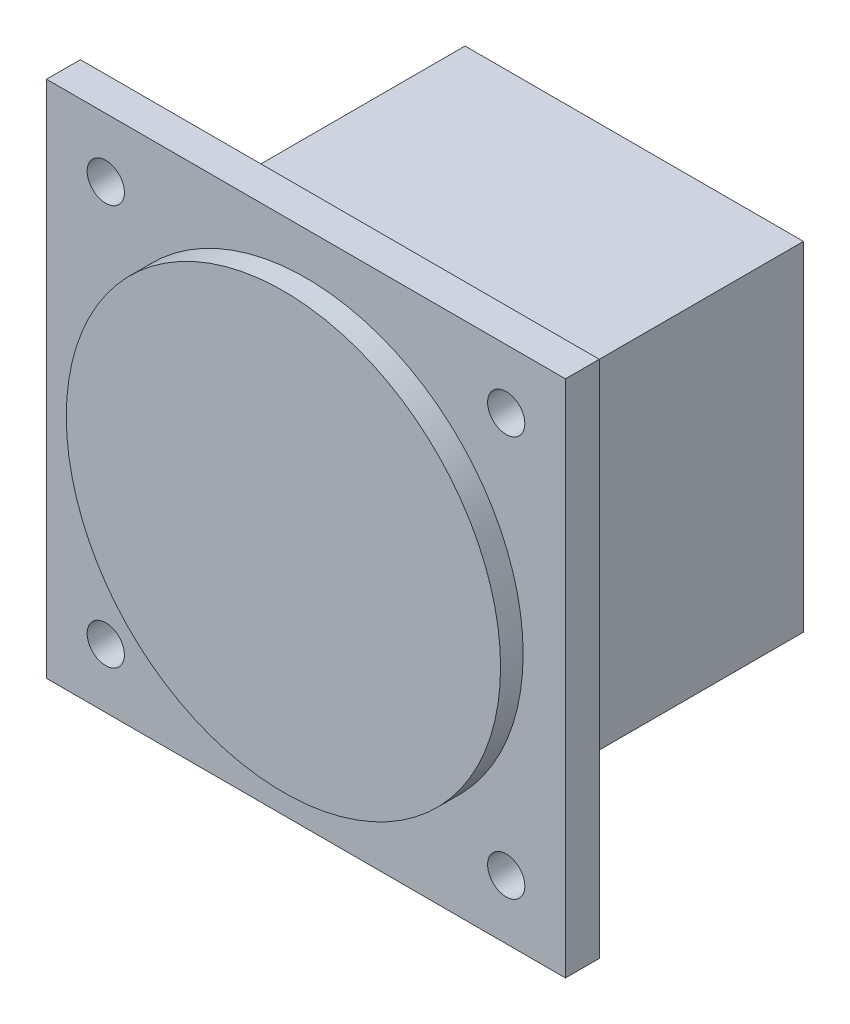
ISO-10303-21;
HEADER;
FILE_DESCRIPTION(('STEP AP214'),'2;1');
FILE_NAME('part.step','',(''),(''),'','','');
FILE_SCHEMA(('AUTOMOTIVE_DESIGN { 1 0 10303 214 1 1 1 1 }'));
ENDSEC;
DATA;
#1=APPLICATION_CONTEXT('core data for automotive mechanical design processes');
#2=APPLICATION_PROTOCOL_DEFINITION('international standard','automotive_design',2000,#1);
#3=PRODUCT_CONTEXT('',#1,'mechanical');
#4=PRODUCT('Part','Part','',(#3));
#5=PRODUCT_RELATED_PRODUCT_CATEGORY('part','',(#4));
#6=PRODUCT_DEFINITION_FORMATION('','',#4);
#7=PRODUCT_DEFINITION_CONTEXT('part definition',#1,'design');
#8=PRODUCT_DEFINITION('design','',#6,#7);
#9=PRODUCT_DEFINITION_SHAPE('','',#8);
#10=(LENGTH_UNIT() NAMED_UNIT(*) SI_UNIT(.MILLI.,.METRE.));
#11=(NAMED_UNIT(*) PLANE_ANGLE_UNIT() SI_UNIT($,.RADIAN.));
#12=(NAMED_UNIT(*) SI_UNIT($,.STERADIAN.) SOLID_ANGLE_UNIT());
#13=UNCERTAINTY_MEASURE_WITH_UNIT(LENGTH_MEASURE(1.E-05),#10,'distance_accuracy_value','');
#14=(GEOMETRIC_REPRESENTATION_CONTEXT(3) GLOBAL_UNCERTAINTY_ASSIGNED_CONTEXT((#13)) GLOBAL_UNIT_ASSIGNED_CONTEXT((#10,
#11,#12)) REPRESENTATION_CONTEXT('',''));
#15=CARTESIAN_POINT('',(0.,0.,0.));
#16=DIRECTION('',(0.,0.,1.));
#17=DIRECTION('',(1.,0.,0.));
#18=AXIS2_PLACEMENT_3D('',#15,#16,#17);
#19=CARTESIAN_POINT('',(0.,0.,0.));
#20=DIRECTION('',(0.,0.,1.));
#21=DIRECTION('',(1.,0.,0.));
#22=AXIS2_PLACEMENT_3D('',#19,#20,#21);
#23=PLANE('',#22);
#24=CARTESIAN_POINT('',(17.7483802077822,-17.7483802077825,0.));
#25=DIRECTION('',(0.,0.,1.));
#26=DIRECTION('',(1.,0.,0.));
#27=AXIS2_PLACEMENT_3D('',#24,#25,#26);
#28=CIRCLE('',#27,1.65);
#29=CARTESIAN_POINT('',(19.3983802077822,-17.7483802077825,0.));
#30=VERTEX_POINT('',#29);
#31=EDGE_CURVE('E153',#30,#30,#28,.T.);
#32=ORIENTED_EDGE('',*,*,#31,.T.);
#33=EDGE_LOOP('',(#32));
#34=FACE_BOUND('',#33,.T.);
#35=CARTESIAN_POINT('',(-17.7483802077824,-17.7483802077823,0.));
#36=DIRECTION('',(0.,0.,1.));
#37=DIRECTION('',(1.,0.,0.));
#38=AXIS2_PLACEMENT_3D('',#35,#36,#37);
#39=CIRCLE('',#38,1.65);
#40=CARTESIAN_POINT('',(-16.0983802077824,-17.7483802077823,0.));
#41=VERTEX_POINT('',#40);
#42=EDGE_CURVE('E203',#41,#41,#39,.T.);
#43=ORIENTED_EDGE('',*,*,#42,.T.);
#44=EDGE_LOOP('',(#43));
#45=FACE_BOUND('',#44,.T.);
#46=CARTESIAN_POINT('',(-17.7483802077823,17.7483802077824,0.));
#47=DIRECTION('',(0.,0.,1.));
#48=DIRECTION('',(1.,0.,0.));
#49=AXIS2_PLACEMENT_3D('',#46,#47,#48);
#50=CIRCLE('',#49,1.65);
#51=CARTESIAN_POINT('',(-16.0983802077823,17.7483802077824,0.));
#52=VERTEX_POINT('',#51);
#53=EDGE_CURVE('E199',#52,#52,#50,.T.);
#54=ORIENTED_EDGE('',*,*,#53,.T.);
#55=EDGE_LOOP('',(#54));
#56=FACE_BOUND('',#55,.T.);
#57=CARTESIAN_POINT('',(17.7483802077825,17.7483802077822,0.));
#58=DIRECTION('',(0.,0.,1.));
#59=DIRECTION('',(1.,0.,0.));
#60=AXIS2_PLACEMENT_3D('',#57,#58,#59);
#61=CIRCLE('',#60,1.65);
#62=CARTESIAN_POINT('',(19.3983802077825,17.7483802077822,0.));
#63=VERTEX_POINT('',#62);
#64=EDGE_CURVE('E195',#63,#63,#61,.T.);
#65=ORIENTED_EDGE('',*,*,#64,.T.);
#66=EDGE_LOOP('',(#65));
#67=FACE_BOUND('',#66,.T.);
#68=DIRECTION('',(1.,0.,0.));
#69=VECTOR('',#68,1.);
#70=CARTESIAN_POINT('',(0.,-23.,0.));
#71=LINE('',#70,#69);
#72=CARTESIAN_POINT('',(-23.,-23.,0.));
#73=VERTEX_POINT('',#72);
#74=CARTESIAN_POINT('',(23.,-23.,0.));
#75=VERTEX_POINT('',#74);
#76=EDGE_CURVE('E143',#73,#75,#71,.T.);
#77=ORIENTED_EDGE('',*,*,#76,.F.);
#78=DIRECTION('',(0.,-1.,0.));
#79=VECTOR('',#78,1.);
#80=CARTESIAN_POINT('',(-23.,0.,0.));
#81=LINE('',#80,#79);
#82=CARTESIAN_POINT('',(-23.,23.,0.));
#83=VERTEX_POINT('',#82);
#84=EDGE_CURVE('E192',#83,#73,#81,.T.);
#85=ORIENTED_EDGE('',*,*,#84,.F.);
#86=DIRECTION('',(1.,0.,0.));
#87=VECTOR('',#86,1.);
#88=CARTESIAN_POINT('',(0.,23.,0.));
#89=LINE('',#88,#87);
#90=CARTESIAN_POINT('',(23.,23.,0.));
#91=VERTEX_POINT('',#90);
#92=EDGE_CURVE('E188',#83,#91,#89,.T.);
#93=ORIENTED_EDGE('',*,*,#92,.T.);
#94=DIRECTION('',(0.,-1.,0.));
#95=VECTOR('',#94,1.);
#96=CARTESIAN_POINT('',(23.,0.,0.));
#97=LINE('',#96,#95);
#98=EDGE_CURVE('E184',#91,#75,#97,.T.);
#99=ORIENTED_EDGE('',*,*,#98,.T.);
#100=EDGE_LOOP('',(#77,#85,#93,#99));
#101=FACE_BOUND('',#100,.T.);
#102=DIRECTION('',(0.,1.,0.));
#103=VECTOR('',#102,1.);
#104=CARTESIAN_POINT('',(-15.,15.,0.));
#105=LINE('',#104,#103);
#106=CARTESIAN_POINT('',(-15.,-15.,0.));
#107=VERTEX_POINT('',#106);
#108=CARTESIAN_POINT('',(-15.,15.,0.));
#109=VERTEX_POINT('',#108);
#110=EDGE_CURVE('E65',#107,#109,#105,.T.);
#111=ORIENTED_EDGE('',*,*,#110,.F.);
#112=DIRECTION('',(-1.,0.,0.));
#113=VECTOR('',#112,1.);
#114=CARTESIAN_POINT('',(15.,-15.,0.));
#115=LINE('',#114,#113);
#116=CARTESIAN_POINT('',(15.,-15.,0.));
#117=VERTEX_POINT('',#116);
#118=EDGE_CURVE('E69',#117,#107,#115,.T.);
#119=ORIENTED_EDGE('',*,*,#118,.F.);
#120=DIRECTION('',(0.,-1.,0.));
#121=VECTOR('',#120,1.);
#122=CARTESIAN_POINT('',(15.,15.,0.));
#123=LINE('',#122,#121);
#124=CARTESIAN_POINT('',(15.,15.,0.));
#125=VERTEX_POINT('',#124);
#126=EDGE_CURVE('E434',#125,#117,#123,.T.);
#127=ORIENTED_EDGE('',*,*,#126,.F.);
#128=DIRECTION('',(1.,0.,0.));
#129=VECTOR('',#128,1.);
#130=CARTESIAN_POINT('',(15.,15.,0.));
#131=LINE('',#130,#129);
#132=EDGE_CURVE('E444',#109,#125,#131,.T.);
#133=ORIENTED_EDGE('',*,*,#132,.F.);
#134=EDGE_LOOP('',(#111,#119,#127,#133));
#135=FACE_BOUND('',#134,.T.);
#136=ADVANCED_FACE('F48',(#34,#45,#56,#67,#101,#135),#23,.F.);
#137=CARTESIAN_POINT('',(0.,-23.,3.));
#138=DIRECTION('',(0.,1.,0.));
#139=DIRECTION('',(0.,0.,1.));
#140=AXIS2_PLACEMENT_3D('',#137,#138,#139);
#141=PLANE('',#140);
#142=ORIENTED_EDGE('',*,*,#76,.T.);
#143=DIRECTION('',(0.,0.,-1.));
#144=VECTOR('',#143,1.);
#145=CARTESIAN_POINT('',(23.,-23.,3.));
#146=LINE('',#145,#144);
#147=CARTESIAN_POINT('',(23.,-23.,3.));
#148=VERTEX_POINT('',#147);
#149=EDGE_CURVE('E52',#148,#75,#146,.T.);
#150=ORIENTED_EDGE('',*,*,#149,.F.);
#151=DIRECTION('',(1.,0.,0.));
#152=VECTOR('',#151,1.);
#153=CARTESIAN_POINT('',(0.,-23.,3.));
#154=LINE('',#153,#152);
#155=CARTESIAN_POINT('',(-23.,-23.,3.));
#156=VERTEX_POINT('',#155);
#157=EDGE_CURVE('E149',#156,#148,#154,.T.);
#158=ORIENTED_EDGE('',*,*,#157,.F.);
#159=DIRECTION('',(0.,0.,-1.));
#160=VECTOR('',#159,1.);
#161=CARTESIAN_POINT('',(-23.,-23.,3.));
#162=LINE('',#161,#160);
#163=EDGE_CURVE('E180',#156,#73,#162,.T.);
#164=ORIENTED_EDGE('',*,*,#163,.T.);
#165=EDGE_LOOP('',(#142,#150,#158,#164));
#166=FACE_BOUND('',#165,.T.);
#167=ADVANCED_FACE('F50',(#166),#141,.F.);
#168=CARTESIAN_POINT('',(23.,0.,3.));
#169=DIRECTION('',(1.,0.,0.));
#170=DIRECTION('',(0.,1.,0.));
#171=AXIS2_PLACEMENT_3D('',#168,#169,#170);
#172=PLANE('',#171);
#173=ORIENTED_EDGE('',*,*,#98,.F.);
#174=DIRECTION('',(0.,0.,-1.));
#175=VECTOR('',#174,1.);
#176=CARTESIAN_POINT('',(23.,23.,3.));
#177=LINE('',#176,#175);
#178=CARTESIAN_POINT('',(23.,23.,3.));
#179=VERTEX_POINT('',#178);
#180=EDGE_CURVE('E215',#179,#91,#177,.T.);
#181=ORIENTED_EDGE('',*,*,#180,.F.);
#182=DIRECTION('',(0.,-1.,0.));
#183=VECTOR('',#182,1.);
#184=CARTESIAN_POINT('',(23.,0.,3.));
#185=LINE('',#184,#183);
#186=EDGE_CURVE('E152',#179,#148,#185,.T.);
#187=ORIENTED_EDGE('',*,*,#186,.T.);
#188=ORIENTED_EDGE('',*,*,#149,.T.);
#189=EDGE_LOOP('',(#173,#181,#187,#188));
#190=FACE_BOUND('',#189,.T.);
#191=ADVANCED_FACE('F223',(#190),#172,.T.);
#192=CARTESIAN_POINT('',(0.,23.,3.));
#193=DIRECTION('',(0.,1.,0.));
#194=DIRECTION('',(0.,0.,1.));
#195=AXIS2_PLACEMENT_3D('',#192,#193,#194);
#196=PLANE('',#195);
#197=ORIENTED_EDGE('',*,*,#92,.F.);
#198=DIRECTION('',(0.,0.,-1.));
#199=VECTOR('',#198,1.);
#200=CARTESIAN_POINT('',(-23.,23.,3.));
#201=LINE('',#200,#199);
#202=CARTESIAN_POINT('',(-23.,23.,3.));
#203=VERTEX_POINT('',#202);
#204=EDGE_CURVE('E213',#203,#83,#201,.T.);
#205=ORIENTED_EDGE('',*,*,#204,.F.);
#206=DIRECTION('',(1.,0.,0.));
#207=VECTOR('',#206,1.);
#208=CARTESIAN_POINT('',(0.,23.,3.));
#209=LINE('',#208,#207);
#210=EDGE_CURVE('E157',#203,#179,#209,.T.);
#211=ORIENTED_EDGE('',*,*,#210,.T.);
#212=ORIENTED_EDGE('',*,*,#180,.T.);
#213=EDGE_LOOP('',(#197,#205,#211,#212));
#214=FACE_BOUND('',#213,.T.);
#215=ADVANCED_FACE('F231',(#214),#196,.T.);
#216=CARTESIAN_POINT('',(-17.7483802077824,-17.7483802077823,3.));
#217=DIRECTION('',(0.,0.,-1.));
#218=DIRECTION('',(-1.,0.,0.));
#219=AXIS2_PLACEMENT_3D('',#216,#217,#218);
#220=CYLINDRICAL_SURFACE('',#219,1.65);
#221=CARTESIAN_POINT('',(-17.7483802077824,-17.7483802077823,3.));
#222=DIRECTION('',(0.,0.,1.));
#223=DIRECTION('',(1.,0.,0.));
#224=AXIS2_PLACEMENT_3D('',#221,#222,#223);
#225=CIRCLE('',#224,1.65);
#226=CARTESIAN_POINT('',(-16.0983802077824,-17.7483802077823,3.));
#227=VERTEX_POINT('',#226);
#228=EDGE_CURVE('E172',#227,#227,#225,.T.);
#229=ORIENTED_EDGE('',*,*,#228,.T.);
#230=EDGE_LOOP('',(#229));
#231=FACE_BOUND('',#230,.T.);
#232=ORIENTED_EDGE('',*,*,#42,.F.);
#233=EDGE_LOOP('',(#232));
#234=FACE_BOUND('',#233,.T.);
#235=ADVANCED_FACE('F276',(#231,#234),#220,.F.);
#236=CARTESIAN_POINT('',(-17.7483802077823,17.7483802077824,3.));
#237=DIRECTION('',(0.,0.,-1.));
#238=DIRECTION('',(-1.,0.,0.));
#239=AXIS2_PLACEMENT_3D('',#236,#237,#238);
#240=CYLINDRICAL_SURFACE('',#239,1.65);
#241=CARTESIAN_POINT('',(-17.7483802077823,17.7483802077824,3.));
#242=DIRECTION('',(0.,0.,1.));
#243=DIRECTION('',(1.,0.,0.));
#244=AXIS2_PLACEMENT_3D('',#241,#242,#243);
#245=CIRCLE('',#244,1.65);
#246=CARTESIAN_POINT('',(-16.0983802077823,17.7483802077824,3.));
#247=VERTEX_POINT('',#246);
#248=EDGE_CURVE('E168',#247,#247,#245,.T.);
#249=ORIENTED_EDGE('',*,*,#248,.T.);
#250=EDGE_LOOP('',(#249));
#251=FACE_BOUND('',#250,.T.);
#252=ORIENTED_EDGE('',*,*,#53,.F.);
#253=EDGE_LOOP('',(#252));
#254=FACE_BOUND('',#253,.T.);
#255=ADVANCED_FACE('F268',(#251,#254),#240,.F.);
#256=CARTESIAN_POINT('',(17.7483802077825,17.7483802077822,3.));
#257=DIRECTION('',(0.,0.,-1.));
#258=DIRECTION('',(-1.,0.,0.));
#259=AXIS2_PLACEMENT_3D('',#256,#257,#258);
#260=CYLINDRICAL_SURFACE('',#259,1.65);
#261=CARTESIAN_POINT('',(17.7483802077825,17.7483802077822,3.));
#262=DIRECTION('',(0.,0.,1.));
#263=DIRECTION('',(1.,0.,0.));
#264=AXIS2_PLACEMENT_3D('',#261,#262,#263);
#265=CIRCLE('',#264,1.65);
#266=CARTESIAN_POINT('',(19.3983802077825,17.7483802077822,3.));
#267=VERTEX_POINT('',#266);
#268=EDGE_CURVE('E164',#267,#267,#265,.T.);
#269=ORIENTED_EDGE('',*,*,#268,.T.);
#270=EDGE_LOOP('',(#269));
#271=FACE_BOUND('',#270,.T.);
#272=ORIENTED_EDGE('',*,*,#64,.F.);
#273=EDGE_LOOP('',(#272));
#274=FACE_BOUND('',#273,.T.);
#275=ADVANCED_FACE('F266',(#271,#274),#260,.F.);
#276=CARTESIAN_POINT('',(-23.,0.,3.));
#277=DIRECTION('',(1.,0.,0.));
#278=DIRECTION('',(0.,1.,0.));
#279=AXIS2_PLACEMENT_3D('',#276,#277,#278);
#280=PLANE('',#279);
#281=ORIENTED_EDGE('',*,*,#84,.T.);
#282=ORIENTED_EDGE('',*,*,#163,.F.);
#283=DIRECTION('',(0.,-1.,0.));
#284=VECTOR('',#283,1.);
#285=CARTESIAN_POINT('',(-23.,0.,3.));
#286=LINE('',#285,#284);
#287=EDGE_CURVE('E161',#203,#156,#286,.T.);
#288=ORIENTED_EDGE('',*,*,#287,.F.);
#289=ORIENTED_EDGE('',*,*,#204,.T.);
#290=EDGE_LOOP('',(#281,#282,#288,#289));
#291=FACE_BOUND('',#290,.T.);
#292=ADVANCED_FACE('F235',(#291),#280,.F.);
#293=CARTESIAN_POINT('',(17.7483802077822,-17.7483802077825,3.));
#294=DIRECTION('',(0.,0.,-1.));
#295=DIRECTION('',(-1.,0.,0.));
#296=AXIS2_PLACEMENT_3D('',#293,#294,#295);
#297=CYLINDRICAL_SURFACE('',#296,1.65);
#298=CARTESIAN_POINT('',(17.7483802077822,-17.7483802077825,3.));
#299=DIRECTION('',(0.,0.,1.));
#300=DIRECTION('',(1.,0.,0.));
#301=AXIS2_PLACEMENT_3D('',#298,#299,#300);
#302=CIRCLE('',#301,1.65);
#303=CARTESIAN_POINT('',(19.3983802077822,-17.7483802077825,3.));
#304=VERTEX_POINT('',#303);
#305=EDGE_CURVE('E176',#304,#304,#302,.T.);
#306=ORIENTED_EDGE('',*,*,#305,.T.);
#307=EDGE_LOOP('',(#306));
#308=FACE_BOUND('',#307,.T.);
#309=ORIENTED_EDGE('',*,*,#31,.F.);
#310=EDGE_LOOP('',(#309));
#311=FACE_BOUND('',#310,.T.);
#312=ADVANCED_FACE('F241',(#308,#311),#297,.F.);
#313=CARTESIAN_POINT('',(0.,0.,3.));
#314=DIRECTION('',(0.,0.,1.));
#315=DIRECTION('',(1.,0.,0.));
#316=AXIS2_PLACEMENT_3D('',#313,#314,#315);
#317=PLANE('',#316);
#318=CARTESIAN_POINT('',(0.,0.,3.));
#319=DIRECTION('',(0.,0.,1.));
#320=DIRECTION('',(1.,0.,0.));
#321=AXIS2_PLACEMENT_3D('',#318,#319,#320);
#322=CIRCLE('',#321,19.25);
#323=CARTESIAN_POINT('',(19.25,0.,3.));
#324=VERTEX_POINT('',#323);
#325=EDGE_CURVE('E11',#324,#324,#322,.T.);
#326=ORIENTED_EDGE('',*,*,#325,.F.);
#327=EDGE_LOOP('',(#326));
#328=FACE_BOUND('',#327,.T.);
#329=ORIENTED_EDGE('',*,*,#157,.T.);
#330=ORIENTED_EDGE('',*,*,#186,.F.);
#331=ORIENTED_EDGE('',*,*,#210,.F.);
#332=ORIENTED_EDGE('',*,*,#287,.T.);
#333=EDGE_LOOP('',(#329,#330,#331,#332));
#334=FACE_BOUND('',#333,.T.);
#335=ORIENTED_EDGE('',*,*,#268,.F.);
#336=EDGE_LOOP('',(#335));
#337=FACE_BOUND('',#336,.T.);
#338=ORIENTED_EDGE('',*,*,#248,.F.);
#339=EDGE_LOOP('',(#338));
#340=FACE_BOUND('',#339,.T.);
#341=ORIENTED_EDGE('',*,*,#228,.F.);
#342=EDGE_LOOP('',(#341));
#343=FACE_BOUND('',#342,.T.);
#344=ORIENTED_EDGE('',*,*,#305,.F.);
#345=EDGE_LOOP('',(#344));
#346=FACE_BOUND('',#345,.T.);
#347=ADVANCED_FACE('F237',(#328,#334,#337,#340,#343,#346),#317,.T.);
#348=CARTESIAN_POINT('',(0.,0.,5.));
#349=DIRECTION('',(0.,0.,-1.));
#350=DIRECTION('',(-1.,0.,0.));
#351=AXIS2_PLACEMENT_3D('',#348,#349,#350);
#352=CYLINDRICAL_SURFACE('',#351,19.25);
#353=CARTESIAN_POINT('',(0.,0.,5.));
#354=DIRECTION('',(0.,0.,1.));
#355=DIRECTION('',(1.,0.,0.));
#356=AXIS2_PLACEMENT_3D('',#353,#354,#355);
#357=CIRCLE('',#356,19.25);
#358=CARTESIAN_POINT('',(19.25,0.,5.));
#359=VERTEX_POINT('',#358);
#360=EDGE_CURVE('E138',#359,#359,#357,.T.);
#361=ORIENTED_EDGE('',*,*,#360,.F.);
#362=EDGE_LOOP('',(#361));
#363=FACE_BOUND('',#362,.T.);
#364=ORIENTED_EDGE('',*,*,#325,.T.);
#365=EDGE_LOOP('',(#364));
#366=FACE_BOUND('',#365,.T.);
#367=ADVANCED_FACE('F240',(#363,#366),#352,.T.);
#368=CARTESIAN_POINT('',(0.,0.,5.));
#369=DIRECTION('',(0.,0.,1.));
#370=DIRECTION('',(1.,0.,0.));
#371=AXIS2_PLACEMENT_3D('',#368,#369,#370);
#372=PLANE('',#371);
#373=ORIENTED_EDGE('',*,*,#360,.T.);
#374=EDGE_LOOP('',(#373));
#375=FACE_BOUND('',#374,.T.);
#376=ADVANCED_FACE('F356',(#375),#372,.T.);
#377=CARTESIAN_POINT('',(-15.,15.,-26.1));
#378=DIRECTION('',(1.,0.,0.));
#379=DIRECTION('',(0.,1.,0.));
#380=AXIS2_PLACEMENT_3D('',#377,#378,#379);
#381=PLANE('',#380);
#382=ORIENTED_EDGE('',*,*,#110,.T.);
#383=DIRECTION('',(0.,0.,1.));
#384=VECTOR('',#383,1.);
#385=CARTESIAN_POINT('',(-15.,15.,-26.1));
#386=LINE('',#385,#384);
#387=CARTESIAN_POINT('',(-15.,15.,-26.1));
#388=VERTEX_POINT('',#387);
#389=EDGE_CURVE('E118',#388,#109,#386,.T.);
#390=ORIENTED_EDGE('',*,*,#389,.F.);
#391=DIRECTION('',(0.,1.,0.));
#392=VECTOR('',#391,1.);
#393=CARTESIAN_POINT('',(-15.,15.,-26.1));
#394=LINE('',#393,#392);
#395=CARTESIAN_POINT('',(-15.,-15.,-26.1));
#396=VERTEX_POINT('',#395);
#397=EDGE_CURVE('E125',#396,#388,#394,.T.);
#398=ORIENTED_EDGE('',*,*,#397,.F.);
#399=DIRECTION('',(0.,0.,1.));
#400=VECTOR('',#399,1.);
#401=CARTESIAN_POINT('',(-15.,-15.,-26.1));
#402=LINE('',#401,#400);
#403=EDGE_CURVE('E431',#396,#107,#402,.T.);
#404=ORIENTED_EDGE('',*,*,#403,.T.);
#405=EDGE_LOOP('',(#382,#390,#398,#404));
#406=FACE_BOUND('',#405,.T.);
#407=ADVANCED_FACE('F136',(#406),#381,.F.);
#408=CARTESIAN_POINT('',(15.,15.,-26.1));
#409=DIRECTION('',(0.,-1.,0.));
#410=DIRECTION('',(0.,0.,-1.));
#411=AXIS2_PLACEMENT_3D('',#408,#409,#410);
#412=PLANE('',#411);
#413=ORIENTED_EDGE('',*,*,#132,.T.);
#414=DIRECTION('',(0.,0.,1.));
#415=VECTOR('',#414,1.);
#416=CARTESIAN_POINT('',(15.,15.,-26.1));
#417=LINE('',#416,#415);
#418=CARTESIAN_POINT('',(15.,15.,-26.1));
#419=VERTEX_POINT('',#418);
#420=EDGE_CURVE('E120',#419,#125,#417,.T.);
#421=ORIENTED_EDGE('',*,*,#420,.F.);
#422=DIRECTION('',(1.,0.,0.));
#423=VECTOR('',#422,1.);
#424=CARTESIAN_POINT('',(15.,15.,-26.1));
#425=LINE('',#424,#423);
#426=EDGE_CURVE('E113',#388,#419,#425,.T.);
#427=ORIENTED_EDGE('',*,*,#426,.F.);
#428=ORIENTED_EDGE('',*,*,#389,.T.);
#429=EDGE_LOOP('',(#413,#421,#427,#428));
#430=FACE_BOUND('',#429,.T.);
#431=ADVANCED_FACE('F116',(#430),#412,.F.);
#432=CARTESIAN_POINT('',(15.,15.,-26.1));
#433=DIRECTION('',(-1.,0.,0.));
#434=DIRECTION('',(0.,-1.,0.));
#435=AXIS2_PLACEMENT_3D('',#432,#433,#434);
#436=PLANE('',#435);
#437=ORIENTED_EDGE('',*,*,#126,.T.);
#438=DIRECTION('',(0.,0.,1.));
#439=VECTOR('',#438,1.);
#440=CARTESIAN_POINT('',(15.,-15.,-26.1));
#441=LINE('',#440,#439);
#442=CARTESIAN_POINT('',(15.,-15.,-26.1));
#443=VERTEX_POINT('',#442);
#444=EDGE_CURVE('E145',#443,#117,#441,.T.);
#445=ORIENTED_EDGE('',*,*,#444,.F.);
#446=DIRECTION('',(0.,-1.,0.));
#447=VECTOR('',#446,1.);
#448=CARTESIAN_POINT('',(15.,15.,-26.1));
#449=LINE('',#448,#447);
#450=EDGE_CURVE('E124',#419,#443,#449,.T.);
#451=ORIENTED_EDGE('',*,*,#450,.F.);
#452=ORIENTED_EDGE('',*,*,#420,.T.);
#453=EDGE_LOOP('',(#437,#445,#451,#452));
#454=FACE_BOUND('',#453,.T.);
#455=ADVANCED_FACE('F400',(#454),#436,.F.);
#456=CARTESIAN_POINT('',(15.,-15.,-26.1));
#457=DIRECTION('',(0.,1.,0.));
#458=DIRECTION('',(0.,0.,1.));
#459=AXIS2_PLACEMENT_3D('',#456,#457,#458);
#460=PLANE('',#459);
#461=ORIENTED_EDGE('',*,*,#118,.T.);
#462=ORIENTED_EDGE('',*,*,#403,.F.);
#463=DIRECTION('',(-1.,0.,0.));
#464=VECTOR('',#463,1.);
#465=CARTESIAN_POINT('',(15.,-15.,-26.1));
#466=LINE('',#465,#464);
#467=EDGE_CURVE('E130',#443,#396,#466,.T.);
#468=ORIENTED_EDGE('',*,*,#467,.F.);
#469=ORIENTED_EDGE('',*,*,#444,.T.);
#470=EDGE_LOOP('',(#461,#462,#468,#469));
#471=FACE_BOUND('',#470,.T.);
#472=ADVANCED_FACE('F409',(#471),#460,.F.);
#473=CARTESIAN_POINT('',(0.,0.,-26.1));
#474=DIRECTION('',(0.,0.,-1.));
#475=DIRECTION('',(-1.,0.,0.));
#476=AXIS2_PLACEMENT_3D('',#473,#474,#475);
#477=PLANE('',#476);
#478=ORIENTED_EDGE('',*,*,#397,.T.);
#479=ORIENTED_EDGE('',*,*,#426,.T.);
#480=ORIENTED_EDGE('',*,*,#450,.T.);
#481=ORIENTED_EDGE('',*,*,#467,.T.);
#482=EDGE_LOOP('',(#478,#479,#480,#481));
#483=FACE_BOUND('',#482,.T.);
#484=ADVANCED_FACE('F128',(#483),#477,.T.);
#485=CLOSED_SHELL('',(#136,#167,#191,#215,#235,#255,#275,#292,#312,#347,#367,#376,#407,#431,
#455,#472,#484));
#486=MANIFOLD_SOLID_BREP('B2',#485);
#487=ADVANCED_BREP_SHAPE_REPRESENTATION('',(#18,#486),#14);
#488=SHAPE_DEFINITION_REPRESENTATION(#9,#487);
ENDSEC;
END-ISO-10303-21;
